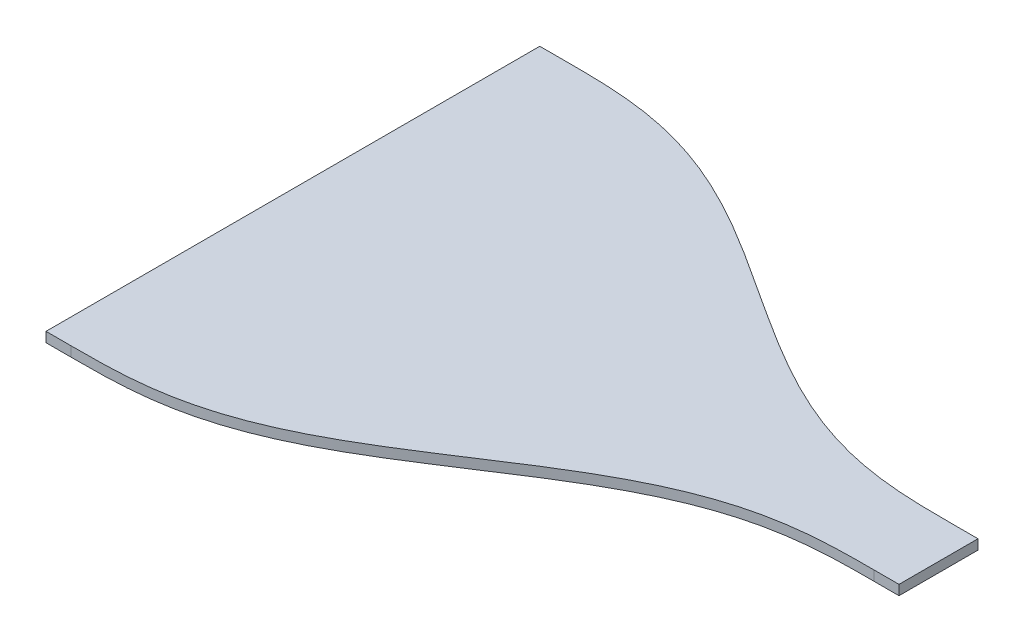
ISO-10303-21;
HEADER;
FILE_DESCRIPTION(('STEP AP214'),'2;1');
FILE_NAME('part.step','',(''),(''),'','','');
FILE_SCHEMA(('AUTOMOTIVE_DESIGN { 1 0 10303 214 1 1 1 1 }'));
ENDSEC;
DATA;
#1=APPLICATION_CONTEXT('core data for automotive mechanical design processes');
#2=APPLICATION_PROTOCOL_DEFINITION('international standard','automotive_design',2000,#1);
#3=PRODUCT_CONTEXT('',#1,'mechanical');
#4=PRODUCT('Part','Part','',(#3));
#5=PRODUCT_RELATED_PRODUCT_CATEGORY('part','',(#4));
#6=PRODUCT_DEFINITION_FORMATION('','',#4);
#7=PRODUCT_DEFINITION_CONTEXT('part definition',#1,'design');
#8=PRODUCT_DEFINITION('design','',#6,#7);
#9=PRODUCT_DEFINITION_SHAPE('','',#8);
#10=(LENGTH_UNIT() NAMED_UNIT(*) SI_UNIT(.MILLI.,.METRE.));
#11=(NAMED_UNIT(*) PLANE_ANGLE_UNIT() SI_UNIT($,.RADIAN.));
#12=(NAMED_UNIT(*) SI_UNIT($,.STERADIAN.) SOLID_ANGLE_UNIT());
#13=UNCERTAINTY_MEASURE_WITH_UNIT(LENGTH_MEASURE(1.E-05),#10,'distance_accuracy_value','');
#14=(GEOMETRIC_REPRESENTATION_CONTEXT(3) GLOBAL_UNCERTAINTY_ASSIGNED_CONTEXT((#13)) GLOBAL_UNIT_ASSIGNED_CONTEXT((#10,
#11,#12)) REPRESENTATION_CONTEXT('',''));
#15=CARTESIAN_POINT('',(0.,0.,0.));
#16=DIRECTION('',(0.,0.,1.));
#17=DIRECTION('',(1.,0.,0.));
#18=AXIS2_PLACEMENT_3D('',#15,#16,#17);
#19=CARTESIAN_POINT('',(628.3600000013,10.,39.9999999998196));
#20=DIRECTION('',(-1.,0.,0.));
#21=DIRECTION('',(0.,0.,1.));
#22=AXIS2_PLACEMENT_3D('',#19,#20,#21);
#23=PLANE('',#22);
#24=DIRECTION('',(0.,0.,-1.));
#25=VECTOR('',#24,1.);
#26=CARTESIAN_POINT('',(628.3600000013,0.,39.9999999998196));
#27=LINE('',#26,#25);
#28=CARTESIAN_POINT('',(628.3600000013,0.,39.9999999998196));
#29=VERTEX_POINT('',#28);
#30=CARTESIAN_POINT('',(628.3600000013,0.,-40.0000000000396));
#31=VERTEX_POINT('',#30);
#32=EDGE_CURVE('E192',#29,#31,#27,.T.);
#33=ORIENTED_EDGE('',*,*,#32,.T.);
#34=DIRECTION('',(0.,-1.,0.));
#35=VECTOR('',#34,1.);
#36=CARTESIAN_POINT('',(628.3600000013,10.,-40.0000000000396));
#37=LINE('',#36,#35);
#38=CARTESIAN_POINT('',(628.3600000013,10.,-40.0000000000396));
#39=VERTEX_POINT('',#38);
#40=EDGE_CURVE('E11',#39,#31,#37,.T.);
#41=ORIENTED_EDGE('',*,*,#40,.F.);
#42=DIRECTION('',(0.,0.,-1.));
#43=VECTOR('',#42,1.);
#44=CARTESIAN_POINT('',(628.3600000013,10.,39.9999999998196));
#45=LINE('',#44,#43);
#46=CARTESIAN_POINT('',(628.3600000013,10.,39.9999999998196));
#47=VERTEX_POINT('',#46);
#48=EDGE_CURVE('E209',#47,#39,#45,.T.);
#49=ORIENTED_EDGE('',*,*,#48,.F.);
#50=DIRECTION('',(0.,-1.,0.));
#51=VECTOR('',#50,1.);
#52=CARTESIAN_POINT('',(628.3600000013,10.,39.9999999998196));
#53=LINE('',#52,#51);
#54=EDGE_CURVE('E125',#47,#29,#53,.T.);
#55=ORIENTED_EDGE('',*,*,#54,.T.);
#56=EDGE_LOOP('',(#33,#41,#49,#55));
#57=FACE_BOUND('',#56,.T.);
#58=ADVANCED_FACE('F33',(#57),#23,.F.);
#59=CARTESIAN_POINT('',(602.9600000013,10.,-40.0000000000396));
#60=DIRECTION('',(0.,0.,1.));
#61=DIRECTION('',(1.,0.,0.));
#62=AXIS2_PLACEMENT_3D('',#59,#60,#61);
#63=PLANE('',#62);
#64=DIRECTION('',(-1.,0.,0.));
#65=VECTOR('',#64,1.);
#66=CARTESIAN_POINT('',(602.9600000013,0.,-40.0000000000396));
#67=LINE('',#66,#65);
#68=CARTESIAN_POINT('',(602.9600000013,0.,-40.0000000000396));
#69=VERTEX_POINT('',#68);
#70=EDGE_CURVE('E189',#31,#69,#67,.T.);
#71=ORIENTED_EDGE('',*,*,#70,.T.);
#72=DIRECTION('',(0.,-1.,0.));
#73=VECTOR('',#72,1.);
#74=CARTESIAN_POINT('',(602.9600000013,10.,-40.0000000000396));
#75=LINE('',#74,#73);
#76=CARTESIAN_POINT('',(602.9600000013,10.,-40.0000000000396));
#77=VERTEX_POINT('',#76);
#78=EDGE_CURVE('E41',#77,#69,#75,.T.);
#79=ORIENTED_EDGE('',*,*,#78,.F.);
#80=DIRECTION('',(-1.,0.,0.));
#81=VECTOR('',#80,1.);
#82=CARTESIAN_POINT('',(602.9600000013,10.,-40.0000000000396));
#83=LINE('',#82,#81);
#84=EDGE_CURVE('E92',#39,#77,#83,.T.);
#85=ORIENTED_EDGE('',*,*,#84,.F.);
#86=ORIENTED_EDGE('',*,*,#40,.T.);
#87=EDGE_LOOP('',(#71,#79,#85,#86));
#88=FACE_BOUND('',#87,.T.);
#89=ADVANCED_FACE('F154',(#88),#63,.F.);
#90=CARTESIAN_POINT('',(602.960000001407,10.,-40.0000000000396));
#91=CARTESIAN_POINT('',(601.828968764817,10.,-40.0000000000395));
#92=CARTESIAN_POINT('',(599.589193262826,10.,-40.0000000379745));
#93=CARTESIAN_POINT('',(594.283488060381,10.,-40.0022157682513));
#94=CARTESIAN_POINT('',(589.919457440368,10.,-40.0179959842549));
#95=CARTESIAN_POINT('',(583.985524287042,10.,-40.0545353512492));
#96=CARTESIAN_POINT('',(578.932534831711,10.,-40.1193118585573));
#97=CARTESIAN_POINT('',(572.056741451444,10.,-40.2443636450084));
#98=CARTESIAN_POINT('',(565.33546819421,10.,-40.4429663080472));
#99=CARTESIAN_POINT('',(558.313030396266,10.,-40.7359357883213));
#100=CARTESIAN_POINT('',(551.261066711014,10.,-41.1438446092437));
#101=CARTESIAN_POINT('',(545.369191286154,10.,-41.5597311978417));
#102=CARTESIAN_POINT('',(539.514027562091,10.,-42.058648284094));
#103=CARTESIAN_POINT('',(533.648357788181,10.,-42.6454520292795));
#104=CARTESIAN_POINT('',(527.803696286015,10.,-43.3243031686937));
#105=CARTESIAN_POINT('',(521.964646592456,10.,-44.0986714821406));
#106=CARTESIAN_POINT('',(514.687032000338,10.,-45.1894996159232));
#107=CARTESIAN_POINT('',(505.983655161913,10.,-46.6992970586992));
#108=CARTESIAN_POINT('',(495.886441901116,10.,-48.759859439909));
#109=CARTESIAN_POINT('',(484.437746207664,10.,-51.5266417609646));
#110=CARTESIAN_POINT('',(473.095033586567,10.,-54.6982051562456));
#111=CARTESIAN_POINT('',(461.868765881894,10.,-58.2602899688746));
#112=CARTESIAN_POINT('',(450.767282366476,10.,-62.1930621203896));
#113=CARTESIAN_POINT('',(439.795009544581,10.,-66.472707341639));
#114=CARTESIAN_POINT('',(428.915328943011,10.,-71.0890373007329));
#115=CARTESIAN_POINT('',(418.128182226315,10.,-76.0177877552463));
#116=CARTESIAN_POINT('',(404.821831781829,10.,-82.5056007695326));
#117=CARTESIAN_POINT('',(389.109463480146,10.,-90.7616634532026));
#118=CARTESIAN_POINT('',(371.139716909059,10.,-100.940384070878));
#119=CARTESIAN_POINT('',(350.986954956719,10.,-113.131465206049));
#120=CARTESIAN_POINT('',(331.083531616839,10.,-125.723038473049));
#121=CARTESIAN_POINT('',(311.331014556509,10.,-138.548686676819));
#122=CARTESIAN_POINT('',(291.62898545345,10.,-151.451312882141));
#123=CARTESIAN_POINT('',(271.876468287283,10.,-164.276962988263));
#124=CARTESIAN_POINT('',(254.460973863669,10.,-175.294585429149));
#125=CARTESIAN_POINT('',(239.377568262097,10.,-184.487962432442));
#126=CARTESIAN_POINT('',(226.674958166475,10.,-191.92562853495));
#127=CARTESIAN_POINT('',(216.421911740623,10.,-197.7178897275));
#128=CARTESIAN_POINT('',(206.031078869437,10.,-203.347077443468));
#129=CARTESIAN_POINT('',(195.491796688084,10.,-208.784697650793));
#130=CARTESIAN_POINT('',(184.831827692497,10.,-213.982198346956));
#131=CARTESIAN_POINT('',(174.044662557852,10.,-218.910987654612));
#132=CARTESIAN_POINT('',(160.454632320874,10.,-224.677267983345));
#133=CARTESIAN_POINT('',(146.684800286889,10.,-229.893458886783));
#134=CARTESIAN_POINT('',(132.700805727171,10.,-234.50896108421));
#135=CARTESIAN_POINT('',(118.522065351502,10.,-238.473331116118));
#136=CARTESIAN_POINT('',(107.073902326192,10.,-241.240157870893));
#137=CARTESIAN_POINT('',(95.5332445328044,10.,-243.595057868691));
#138=CARTESIAN_POINT('',(83.9178291269025,10.,-245.53976584604));
#139=CARTESIAN_POINT('',(72.2406089054652,10.,-247.085714429803));
#140=CARTESIAN_POINT('',(61.9887818599413,10.,-248.108986795793));
#141=CARTESIAN_POINT('',(53.1775235231903,10.,-248.771552860042));
#142=CARTESIAN_POINT('',(45.9672711279011,10.,-249.187011570926));
#143=CARTESIAN_POINT('',(40.3350550397922,10.,-249.444262899305));
#144=CARTESIAN_POINT('',(34.8728406977889,10.,-249.638764529403));
#145=CARTESIAN_POINT('',(29.453823447928,10.,-249.780646369478));
#146=CARTESIAN_POINT('',(24.8671350060192,10.,-249.868183183999));
#147=CARTESIAN_POINT('',(20.6777424132859,10.,-249.921173319688));
#148=CARTESIAN_POINT('',(16.9488270513643,10.,-249.959167008785));
#149=CARTESIAN_POINT('',(12.3138240515522,10.,-249.983976490944));
#150=CARTESIAN_POINT('',(8.79629780648235,10.,-249.99778422102));
#151=CARTESIAN_POINT('',(3.35877029233717,10.,-250.000000003008));
#152=CARTESIAN_POINT('',(1.13103123629953,10.,-250.));
#153=CARTESIAN_POINT('',(2.39415996797719E-10,10.,-250.));
#154=B_SPLINE_CURVE_WITH_KNOTS('',4,(#90,#91,#92,#93,#94,#95,#96,#97,#98,#99,#100,#101,#102,
#103,#104,#105,#106,#107,#108,#109,#110,#111,#112,#113,#114,#115,#116,#117,#118,#119,#120,#121,
#122,#123,#124,#125,#126,#127,#128,#129,#130,#131,#132,#133,#134,#135,#136,#137,#138,#139,#140,
#141,#142,#143,#144,#145,#146,#147,#148,#149,#150,#151,#152,#153),.UNSPECIFIED.,.F.,.F.,(5,1,1,
1,1,1,1,1,1,1,1,1,1,1,1,1,1,1,1,1,1,1,1,1,1,1,1,1,1,1,1,1,1,1,1,1,1,1,1,1,1,1,1,1,1,1,1,1,1,1,1,
1,1,1,1,1,1,1,1,1,5),(0.0781741986426941,0.0851163588564478,0.0920585190702014,
0.0990006792839551,0.105942839497709,0.112884999711463,0.119827159925216,0.133711480352724,
0.141333544060687,0.14895560776865,0.156577671476614,0.164199735184577,0.171821790333472,
0.179443845482367,0.187065900631262,0.194687955780156,0.209932080107854,0.225176204435552,
0.240420329394165,0.255664454352778,0.270908549710445,0.286152645068112,0.30139682696197,
0.316641008855828,0.332099848073137,0.347558687290446,0.378046953694835,0.408535220099223,
0.43902347535238,0.469511730605537,0.500000000000003,0.53048826939447,0.560976524647627,
0.591464779900784,0.606708913102978,0.621953046305172,0.637197179507367,0.652441312709561,
0.667900151926867,0.683358991144173,0.698603173038031,0.713847354931889,0.744335545647224,
0.759579670605836,0.774823795564449,0.790067919892147,0.805312044219845,0.820556154517636,
0.835800264815427,0.851044392231356,0.85866645593932,0.866288519647284,0.873230679861037,
0.880172840074789,0.887115000288541,0.894057160502294,0.89752824060917,0.900999320716046,
0.907941480929798,0.914883641143551,0.921825801357303),.UNSPECIFIED.);
#155=DIRECTION('',(0.,-1.,0.));
#156=VECTOR('',#155,1.);
#157=SURFACE_OF_LINEAR_EXTRUSION('',#154,#156);
#158=CARTESIAN_POINT('',(602.960000001407,0.,-40.0000000000396));
#159=CARTESIAN_POINT('',(601.828968764817,0.,-40.0000000000395));
#160=CARTESIAN_POINT('',(599.589193262826,0.,-40.0000000379745));
#161=CARTESIAN_POINT('',(594.283488060381,0.,-40.0022157682513));
#162=CARTESIAN_POINT('',(589.919457440368,0.,-40.0179959842549));
#163=CARTESIAN_POINT('',(583.985524287042,0.,-40.0545353512492));
#164=CARTESIAN_POINT('',(578.932534831711,0.,-40.1193118585573));
#165=CARTESIAN_POINT('',(572.056741451444,0.,-40.2443636450084));
#166=CARTESIAN_POINT('',(565.33546819421,0.,-40.4429663080472));
#167=CARTESIAN_POINT('',(558.313030396266,0.,-40.7359357883213));
#168=CARTESIAN_POINT('',(551.261066711014,0.,-41.1438446092437));
#169=CARTESIAN_POINT('',(545.369191286154,0.,-41.5597311978417));
#170=CARTESIAN_POINT('',(539.514027562091,0.,-42.058648284094));
#171=CARTESIAN_POINT('',(533.648357788181,0.,-42.6454520292795));
#172=CARTESIAN_POINT('',(527.803696286015,0.,-43.3243031686937));
#173=CARTESIAN_POINT('',(521.964646592456,0.,-44.0986714821406));
#174=CARTESIAN_POINT('',(514.687032000338,0.,-45.1894996159232));
#175=CARTESIAN_POINT('',(505.983655161913,0.,-46.6992970586992));
#176=CARTESIAN_POINT('',(495.886441901116,0.,-48.759859439909));
#177=CARTESIAN_POINT('',(484.437746207664,0.,-51.5266417609646));
#178=CARTESIAN_POINT('',(473.095033586567,0.,-54.6982051562456));
#179=CARTESIAN_POINT('',(461.868765881894,0.,-58.2602899688746));
#180=CARTESIAN_POINT('',(450.767282366476,0.,-62.1930621203896));
#181=CARTESIAN_POINT('',(439.795009544581,0.,-66.472707341639));
#182=CARTESIAN_POINT('',(428.915328943011,0.,-71.0890373007329));
#183=CARTESIAN_POINT('',(418.128182226315,0.,-76.0177877552463));
#184=CARTESIAN_POINT('',(404.821831781829,0.,-82.5056007695326));
#185=CARTESIAN_POINT('',(389.109463480146,0.,-90.7616634532026));
#186=CARTESIAN_POINT('',(371.139716909059,0.,-100.940384070878));
#187=CARTESIAN_POINT('',(350.986954956719,0.,-113.131465206049));
#188=CARTESIAN_POINT('',(331.083531616839,0.,-125.723038473049));
#189=CARTESIAN_POINT('',(311.331014556509,0.,-138.548686676819));
#190=CARTESIAN_POINT('',(291.62898545345,0.,-151.451312882141));
#191=CARTESIAN_POINT('',(271.876468287283,0.,-164.276962988263));
#192=CARTESIAN_POINT('',(254.460973863669,0.,-175.294585429149));
#193=CARTESIAN_POINT('',(239.377568262097,0.,-184.487962432442));
#194=CARTESIAN_POINT('',(226.674958166475,0.,-191.92562853495));
#195=CARTESIAN_POINT('',(216.421911740623,0.,-197.7178897275));
#196=CARTESIAN_POINT('',(206.031078869437,0.,-203.347077443468));
#197=CARTESIAN_POINT('',(195.491796688084,0.,-208.784697650793));
#198=CARTESIAN_POINT('',(184.831827692497,0.,-213.982198346956));
#199=CARTESIAN_POINT('',(174.044662557852,0.,-218.910987654612));
#200=CARTESIAN_POINT('',(160.454632320874,0.,-224.677267983345));
#201=CARTESIAN_POINT('',(146.684800286889,0.,-229.893458886783));
#202=CARTESIAN_POINT('',(132.700805727171,0.,-234.50896108421));
#203=CARTESIAN_POINT('',(118.522065351502,0.,-238.473331116118));
#204=CARTESIAN_POINT('',(107.073902326192,0.,-241.240157870893));
#205=CARTESIAN_POINT('',(95.5332445328044,0.,-243.595057868691));
#206=CARTESIAN_POINT('',(83.9178291269025,0.,-245.53976584604));
#207=CARTESIAN_POINT('',(72.2406089054652,0.,-247.085714429803));
#208=CARTESIAN_POINT('',(61.9887818599413,0.,-248.108986795793));
#209=CARTESIAN_POINT('',(53.1775235231903,0.,-248.771552860042));
#210=CARTESIAN_POINT('',(45.9672711279011,0.,-249.187011570926));
#211=CARTESIAN_POINT('',(40.3350550397922,0.,-249.444262899305));
#212=CARTESIAN_POINT('',(34.8728406977889,0.,-249.638764529403));
#213=CARTESIAN_POINT('',(29.453823447928,0.,-249.780646369478));
#214=CARTESIAN_POINT('',(24.8671350060192,0.,-249.868183183999));
#215=CARTESIAN_POINT('',(20.6777424132859,0.,-249.921173319688));
#216=CARTESIAN_POINT('',(16.9488270513643,0.,-249.959167008785));
#217=CARTESIAN_POINT('',(12.3138240515522,0.,-249.983976490944));
#218=CARTESIAN_POINT('',(8.79629780648235,0.,-249.99778422102));
#219=CARTESIAN_POINT('',(3.35877029233717,0.,-250.000000003008));
#220=CARTESIAN_POINT('',(1.13103123629953,0.,-250.));
#221=CARTESIAN_POINT('',(2.39415996797719E-10,0.,-250.));
#222=B_SPLINE_CURVE_WITH_KNOTS('',4,(#158,#159,#160,#161,#162,#163,#164,#165,#166,#167,#168,
#169,#170,#171,#172,#173,#174,#175,#176,#177,#178,#179,#180,#181,#182,#183,#184,#185,#186,#187,
#188,#189,#190,#191,#192,#193,#194,#195,#196,#197,#198,#199,#200,#201,#202,#203,#204,#205,#206,
#207,#208,#209,#210,#211,#212,#213,#214,#215,#216,#217,#218,#219,#220,#221),.UNSPECIFIED.,.F.,
.F.,(5,1,1,1,1,1,1,1,1,1,1,1,1,1,1,1,1,1,1,1,1,1,1,1,1,1,1,1,1,1,1,1,1,1,1,1,1,1,1,1,1,1,1,1,1,
1,1,1,1,1,1,1,1,1,1,1,1,1,1,1,5),(0.0781741986426941,0.0851163588564478,0.0920585190702014,
0.0990006792839551,0.105942839497709,0.112884999711463,0.119827159925216,0.133711480352724,
0.141333544060687,0.14895560776865,0.156577671476614,0.164199735184577,0.171821790333472,
0.179443845482367,0.187065900631262,0.194687955780156,0.209932080107854,0.225176204435552,
0.240420329394165,0.255664454352778,0.270908549710445,0.286152645068112,0.30139682696197,
0.316641008855828,0.332099848073137,0.347558687290446,0.378046953694835,0.408535220099223,
0.43902347535238,0.469511730605537,0.500000000000003,0.53048826939447,0.560976524647627,
0.591464779900784,0.606708913102978,0.621953046305172,0.637197179507367,0.652441312709561,
0.667900151926867,0.683358991144173,0.698603173038031,0.713847354931889,0.744335545647224,
0.759579670605836,0.774823795564449,0.790067919892147,0.805312044219845,0.820556154517636,
0.835800264815427,0.851044392231356,0.85866645593932,0.866288519647284,0.873230679861037,
0.880172840074789,0.887115000288541,0.894057160502294,0.89752824060917,0.900999320716046,
0.907941480929798,0.914883641143551,0.921825801357303),.UNSPECIFIED.);
#223=CARTESIAN_POINT('',(2.39415996797719E-10,0.,-250.));
#224=VERTEX_POINT('',#223);
#225=EDGE_CURVE('E185',#69,#224,#222,.T.);
#226=ORIENTED_EDGE('',*,*,#225,.T.);
#227=DIRECTION('',(0.,-1.,0.));
#228=VECTOR('',#227,1.);
#229=CARTESIAN_POINT('',(2.39415996797719E-10,10.,-250.));
#230=LINE('',#229,#228);
#231=CARTESIAN_POINT('',(2.39415996797719E-10,10.,-250.));
#232=VERTEX_POINT('',#231);
#233=EDGE_CURVE('E177',#232,#224,#230,.T.);
#234=ORIENTED_EDGE('',*,*,#233,.F.);
#235=EDGE_CURVE('E156',#77,#232,#154,.T.);
#236=ORIENTED_EDGE('',*,*,#235,.F.);
#237=ORIENTED_EDGE('',*,*,#78,.T.);
#238=EDGE_LOOP('',(#226,#234,#236,#237));
#239=FACE_BOUND('',#238,.T.);
#240=ADVANCED_FACE('F150',(#239),#157,.F.);
#241=CARTESIAN_POINT('',(2.09489326927215E-10,10.,-250.));
#242=DIRECTION('',(0.,0.,1.));
#243=DIRECTION('',(1.,0.,0.));
#244=AXIS2_PLACEMENT_3D('',#241,#242,#243);
#245=PLANE('',#244);
#246=DIRECTION('',(-1.,0.,0.));
#247=VECTOR('',#246,1.);
#248=CARTESIAN_POINT('',(2.09489326927215E-10,0.,-250.));
#249=LINE('',#248,#247);
#250=CARTESIAN_POINT('',(-25.3999999997905,0.,-250.));
#251=VERTEX_POINT('',#250);
#252=EDGE_CURVE('E175',#224,#251,#249,.T.);
#253=ORIENTED_EDGE('',*,*,#252,.T.);
#254=DIRECTION('',(0.,-1.,0.));
#255=VECTOR('',#254,1.);
#256=CARTESIAN_POINT('',(-25.3999999997905,10.,-250.));
#257=LINE('',#256,#255);
#258=CARTESIAN_POINT('',(-25.3999999997905,10.,-250.));
#259=VERTEX_POINT('',#258);
#260=EDGE_CURVE('E173',#259,#251,#257,.T.);
#261=ORIENTED_EDGE('',*,*,#260,.F.);
#262=DIRECTION('',(-1.,0.,0.));
#263=VECTOR('',#262,1.);
#264=CARTESIAN_POINT('',(2.09489326927215E-10,10.,-250.));
#265=LINE('',#264,#263);
#266=EDGE_CURVE('E162',#232,#259,#265,.T.);
#267=ORIENTED_EDGE('',*,*,#266,.F.);
#268=ORIENTED_EDGE('',*,*,#233,.T.);
#269=EDGE_LOOP('',(#253,#261,#267,#268));
#270=FACE_BOUND('',#269,.T.);
#271=ADVANCED_FACE('F146',(#270),#245,.F.);
#272=CARTESIAN_POINT('',(-25.3999999997905,10.,250.));
#273=DIRECTION('',(1.,0.,0.));
#274=DIRECTION('',(0.,0.,-1.));
#275=AXIS2_PLACEMENT_3D('',#272,#273,#274);
#276=PLANE('',#275);
#277=DIRECTION('',(0.,0.,1.));
#278=VECTOR('',#277,1.);
#279=CARTESIAN_POINT('',(-25.3999999997905,0.,250.));
#280=LINE('',#279,#278);
#281=CARTESIAN_POINT('',(-25.3999999997905,0.,250.));
#282=VERTEX_POINT('',#281);
#283=EDGE_CURVE('E179',#251,#282,#280,.T.);
#284=ORIENTED_EDGE('',*,*,#283,.T.);
#285=DIRECTION('',(0.,-1.,0.));
#286=VECTOR('',#285,1.);
#287=CARTESIAN_POINT('',(-25.3999999997905,10.,250.));
#288=LINE('',#287,#286);
#289=CARTESIAN_POINT('',(-25.3999999997905,10.,250.));
#290=VERTEX_POINT('',#289);
#291=EDGE_CURVE('E120',#290,#282,#288,.T.);
#292=ORIENTED_EDGE('',*,*,#291,.F.);
#293=DIRECTION('',(0.,0.,1.));
#294=VECTOR('',#293,1.);
#295=CARTESIAN_POINT('',(-25.3999999997905,10.,250.));
#296=LINE('',#295,#294);
#297=EDGE_CURVE('E111',#259,#290,#296,.T.);
#298=ORIENTED_EDGE('',*,*,#297,.F.);
#299=ORIENTED_EDGE('',*,*,#260,.T.);
#300=EDGE_LOOP('',(#284,#292,#298,#299));
#301=FACE_BOUND('',#300,.T.);
#302=ADVANCED_FACE('F143',(#301),#276,.F.);
#303=CARTESIAN_POINT('',(2.09486453791458E-10,10.,250.));
#304=DIRECTION('',(0.,0.,-1.));
#305=DIRECTION('',(-1.,0.,0.));
#306=AXIS2_PLACEMENT_3D('',#303,#304,#305);
#307=PLANE('',#306);
#308=DIRECTION('',(1.,0.,0.));
#309=VECTOR('',#308,1.);
#310=CARTESIAN_POINT('',(2.09486453791458E-10,0.,250.));
#311=LINE('',#310,#309);
#312=CARTESIAN_POINT('',(2.09486453791458E-10,0.,250.));
#313=VERTEX_POINT('',#312);
#314=EDGE_CURVE('E119',#282,#313,#311,.T.);
#315=ORIENTED_EDGE('',*,*,#314,.T.);
#316=DIRECTION('',(0.,-1.,0.));
#317=VECTOR('',#316,1.);
#318=CARTESIAN_POINT('',(2.09486453791458E-10,10.,250.));
#319=LINE('',#318,#317);
#320=CARTESIAN_POINT('',(2.09486453791458E-10,10.,250.));
#321=VERTEX_POINT('',#320);
#322=EDGE_CURVE('E116',#321,#313,#319,.T.);
#323=ORIENTED_EDGE('',*,*,#322,.F.);
#324=DIRECTION('',(1.,0.,0.));
#325=VECTOR('',#324,1.);
#326=CARTESIAN_POINT('',(2.09486453791458E-10,10.,250.));
#327=LINE('',#326,#325);
#328=EDGE_CURVE('E105',#290,#321,#327,.T.);
#329=ORIENTED_EDGE('',*,*,#328,.F.);
#330=ORIENTED_EDGE('',*,*,#291,.T.);
#331=EDGE_LOOP('',(#315,#323,#329,#330));
#332=FACE_BOUND('',#331,.T.);
#333=ADVANCED_FACE('F117',(#332),#307,.F.);
#334=CARTESIAN_POINT('',(2.39412823101957E-10,10.,250.));
#335=CARTESIAN_POINT('',(1.13103123629173,10.,250.));
#336=CARTESIAN_POINT('',(3.35877029233124,10.,250.000000003006));
#337=CARTESIAN_POINT('',(8.79629780645916,10.,249.997784221017));
#338=CARTESIAN_POINT('',(12.3138240515223,10.,249.983976490939));
#339=CARTESIAN_POINT('',(16.9488270513344,10.,249.959167008779));
#340=CARTESIAN_POINT('',(20.677742413256,10.,249.921173319681));
#341=CARTESIAN_POINT('',(24.8671350059893,10.,249.86818318399));
#342=CARTESIAN_POINT('',(29.4538234478981,10.,249.780646369467));
#343=CARTESIAN_POINT('',(34.872840697759,10.,249.63876452939));
#344=CARTESIAN_POINT('',(40.3350550397622,10.,249.44426289929));
#345=CARTESIAN_POINT('',(45.967271127871,10.,249.187011570909));
#346=CARTESIAN_POINT('',(53.1775235231601,10.,248.771552860022));
#347=CARTESIAN_POINT('',(61.9887818599108,10.,248.10898679577));
#348=CARTESIAN_POINT('',(72.2406089054343,10.,247.085714429777));
#349=CARTESIAN_POINT('',(83.9178291268711,10.,245.53976584601));
#350=CARTESIAN_POINT('',(95.5332445327723,10.,243.595057868656));
#351=CARTESIAN_POINT('',(107.07390232616,10.,241.240157870854));
#352=CARTESIAN_POINT('',(118.522065351468,10.,238.473331116075));
#353=CARTESIAN_POINT('',(132.700805727136,10.,234.508961084161));
#354=CARTESIAN_POINT('',(146.684800286852,10.,229.89345888673));
#355=CARTESIAN_POINT('',(160.454632320835,10.,224.677267983287));
#356=CARTESIAN_POINT('',(174.044662557811,10.,218.910987654548));
#357=CARTESIAN_POINT('',(184.831827692454,10.,213.982198346889));
#358=CARTESIAN_POINT('',(195.491796688039,10.,208.784697650722));
#359=CARTESIAN_POINT('',(206.03107886939,10.,203.347077443392));
#360=CARTESIAN_POINT('',(216.421911740574,10.,197.717889727421));
#361=CARTESIAN_POINT('',(226.674958166424,10.,191.925628534867));
#362=CARTESIAN_POINT('',(239.377568262043,10.,184.487962432355));
#363=CARTESIAN_POINT('',(254.460973863612,10.,175.294585429056));
#364=CARTESIAN_POINT('',(271.876468287222,10.,164.276962988164));
#365=CARTESIAN_POINT('',(291.628985453384,10.,151.451312882034));
#366=CARTESIAN_POINT('',(311.331014556438,10.,138.548686676706));
#367=CARTESIAN_POINT('',(331.083531616764,10.,125.723038472929));
#368=CARTESIAN_POINT('',(350.986954956639,10.,113.131465205921));
#369=CARTESIAN_POINT('',(371.139716908975,10.,100.940384070742));
#370=CARTESIAN_POINT('',(389.109463480058,10.,90.7616634530606));
#371=CARTESIAN_POINT('',(404.821831781738,10.,82.5056007693849));
#372=CARTESIAN_POINT('',(418.128182226222,10.,76.0177877550937));
#373=CARTESIAN_POINT('',(428.915328942916,10.,71.0890373005764));
#374=CARTESIAN_POINT('',(439.795009544484,10.,66.4727073414786));
#375=CARTESIAN_POINT('',(450.767282366377,10.,62.1930621202251));
#376=CARTESIAN_POINT('',(461.868765881794,10.,58.2602899687061));
#377=CARTESIAN_POINT('',(473.095033586466,10.,54.698205156073));
#378=CARTESIAN_POINT('',(484.437746207562,10.,51.5266417607878));
#379=CARTESIAN_POINT('',(495.886441901013,10.,48.7598594397281));
#380=CARTESIAN_POINT('',(505.983655161808,10.,46.6992970585145));
#381=CARTESIAN_POINT('',(514.687032000233,10.,45.1894996157354));
#382=CARTESIAN_POINT('',(521.964646592351,10.,44.0986714819502));
#383=CARTESIAN_POINT('',(527.80369628591,10.,43.3243031685011));
#384=CARTESIAN_POINT('',(533.648357788075,10.,42.6454520290848));
#385=CARTESIAN_POINT('',(539.514027561985,10.,42.0586482838972));
#386=CARTESIAN_POINT('',(545.369191286049,10.,41.5597311976427));
#387=CARTESIAN_POINT('',(551.261066710907,10.,41.1438446090425));
#388=CARTESIAN_POINT('',(558.31303039616,10.,40.7359357881176));
#389=CARTESIAN_POINT('',(565.335468194103,10.,40.4429663078409));
#390=CARTESIAN_POINT('',(572.056741451337,10.,40.2443636447996));
#391=CARTESIAN_POINT('',(578.932534831605,10.,40.1193118583461));
#392=CARTESIAN_POINT('',(583.985524286936,10.,40.0545353510361));
#393=CARTESIAN_POINT('',(589.919457440262,10.,40.0179959840397));
#394=CARTESIAN_POINT('',(594.2834880603,10.,40.0022157680343));
#395=CARTESIAN_POINT('',(599.589193262804,10.,40.0000000377557));
#396=CARTESIAN_POINT('',(601.828968764789,10.,39.9999999998199));
#397=CARTESIAN_POINT('',(602.960000001407,10.,39.9999999998195));
#398=B_SPLINE_CURVE_WITH_KNOTS('',4,(#334,#335,#336,#337,#338,#339,#340,#341,#342,#343,#344,
#345,#346,#347,#348,#349,#350,#351,#352,#353,#354,#355,#356,#357,#358,#359,#360,#361,#362,#363,
#364,#365,#366,#367,#368,#369,#370,#371,#372,#373,#374,#375,#376,#377,#378,#379,#380,#381,#382,
#383,#384,#385,#386,#387,#388,#389,#390,#391,#392,#393,#394,#395,#396,#397),.UNSPECIFIED.,.F.,
.F.,(5,1,1,1,1,1,1,1,1,1,1,1,1,1,1,1,1,1,1,1,1,1,1,1,1,1,1,1,1,1,1,1,1,1,1,1,1,1,1,1,1,1,1,1,1,
1,1,1,1,1,1,1,1,1,1,1,1,1,1,1,5),(0.0781741986426941,0.0851163588564464,0.0920585190701987,
0.099000679283951,0.102471759390827,0.105942839497703,0.112884999711456,0.119827159925208,
0.12676932013896,0.133711480352713,0.141333544060677,0.148955607768641,0.16419973518457,
0.179443845482361,0.194687955780152,0.20993208010785,0.225176204435548,0.240420329394161,
0.255664454352773,0.286152645068108,0.301396826961966,0.316641008855824,0.33209984807313,
0.347558687290436,0.36280282049263,0.378046953694825,0.393291086897019,0.408535220099213,
0.43902347535237,0.469511730605527,0.499999999999994,0.53048826939446,0.560976524647617,
0.591464779900774,0.621953046305162,0.652441312709551,0.66790015192686,0.683358991144169,
0.698603173038027,0.713847354931885,0.729091450289552,0.744335545647219,0.759579670605832,
0.774823795564445,0.790067919892143,0.805312044219841,0.812934099368736,0.82055615451763,
0.828178209666525,0.83580026481542,0.843422328523383,0.851044392231347,0.85866645593931,
0.866288519647273,0.880172840074781,0.887115000288535,0.894057160502288,0.900999320716042,
0.907941480929796,0.914883641143549,0.921825801357303),.UNSPECIFIED.);
#399=DIRECTION('',(0.,-1.,0.));
#400=VECTOR('',#399,1.);
#401=SURFACE_OF_LINEAR_EXTRUSION('',#398,#400);
#402=CARTESIAN_POINT('',(2.39412823101957E-10,0.,250.));
#403=CARTESIAN_POINT('',(1.13103123629173,0.,250.));
#404=CARTESIAN_POINT('',(3.35877029233124,0.,250.000000003006));
#405=CARTESIAN_POINT('',(8.79629780645916,0.,249.997784221017));
#406=CARTESIAN_POINT('',(12.3138240515223,0.,249.983976490939));
#407=CARTESIAN_POINT('',(16.9488270513344,0.,249.959167008779));
#408=CARTESIAN_POINT('',(20.677742413256,0.,249.921173319681));
#409=CARTESIAN_POINT('',(24.8671350059893,0.,249.86818318399));
#410=CARTESIAN_POINT('',(29.4538234478981,0.,249.780646369467));
#411=CARTESIAN_POINT('',(34.872840697759,0.,249.63876452939));
#412=CARTESIAN_POINT('',(40.3350550397622,0.,249.44426289929));
#413=CARTESIAN_POINT('',(45.967271127871,0.,249.187011570909));
#414=CARTESIAN_POINT('',(53.1775235231601,0.,248.771552860022));
#415=CARTESIAN_POINT('',(61.9887818599108,0.,248.10898679577));
#416=CARTESIAN_POINT('',(72.2406089054343,0.,247.085714429777));
#417=CARTESIAN_POINT('',(83.9178291268711,0.,245.53976584601));
#418=CARTESIAN_POINT('',(95.5332445327723,0.,243.595057868656));
#419=CARTESIAN_POINT('',(107.07390232616,0.,241.240157870854));
#420=CARTESIAN_POINT('',(118.522065351468,0.,238.473331116075));
#421=CARTESIAN_POINT('',(132.700805727136,0.,234.508961084161));
#422=CARTESIAN_POINT('',(146.684800286852,0.,229.89345888673));
#423=CARTESIAN_POINT('',(160.454632320835,0.,224.677267983287));
#424=CARTESIAN_POINT('',(174.044662557811,0.,218.910987654548));
#425=CARTESIAN_POINT('',(184.831827692454,0.,213.982198346889));
#426=CARTESIAN_POINT('',(195.491796688039,0.,208.784697650722));
#427=CARTESIAN_POINT('',(206.03107886939,0.,203.347077443392));
#428=CARTESIAN_POINT('',(216.421911740574,0.,197.717889727421));
#429=CARTESIAN_POINT('',(226.674958166424,0.,191.925628534867));
#430=CARTESIAN_POINT('',(239.377568262043,0.,184.487962432355));
#431=CARTESIAN_POINT('',(254.460973863612,0.,175.294585429056));
#432=CARTESIAN_POINT('',(271.876468287222,0.,164.276962988164));
#433=CARTESIAN_POINT('',(291.628985453384,0.,151.451312882034));
#434=CARTESIAN_POINT('',(311.331014556438,0.,138.548686676706));
#435=CARTESIAN_POINT('',(331.083531616764,0.,125.723038472929));
#436=CARTESIAN_POINT('',(350.986954956639,0.,113.131465205921));
#437=CARTESIAN_POINT('',(371.139716908975,0.,100.940384070742));
#438=CARTESIAN_POINT('',(389.109463480058,0.,90.7616634530606));
#439=CARTESIAN_POINT('',(404.821831781738,0.,82.5056007693849));
#440=CARTESIAN_POINT('',(418.128182226222,0.,76.0177877550937));
#441=CARTESIAN_POINT('',(428.915328942916,0.,71.0890373005764));
#442=CARTESIAN_POINT('',(439.795009544484,0.,66.4727073414786));
#443=CARTESIAN_POINT('',(450.767282366377,0.,62.1930621202251));
#444=CARTESIAN_POINT('',(461.868765881794,0.,58.2602899687061));
#445=CARTESIAN_POINT('',(473.095033586466,0.,54.698205156073));
#446=CARTESIAN_POINT('',(484.437746207562,0.,51.5266417607878));
#447=CARTESIAN_POINT('',(495.886441901013,0.,48.7598594397281));
#448=CARTESIAN_POINT('',(505.983655161808,0.,46.6992970585145));
#449=CARTESIAN_POINT('',(514.687032000233,0.,45.1894996157354));
#450=CARTESIAN_POINT('',(521.964646592351,0.,44.0986714819502));
#451=CARTESIAN_POINT('',(527.80369628591,0.,43.3243031685011));
#452=CARTESIAN_POINT('',(533.648357788075,0.,42.6454520290848));
#453=CARTESIAN_POINT('',(539.514027561985,0.,42.0586482838972));
#454=CARTESIAN_POINT('',(545.369191286049,0.,41.5597311976427));
#455=CARTESIAN_POINT('',(551.261066710907,0.,41.1438446090425));
#456=CARTESIAN_POINT('',(558.31303039616,0.,40.7359357881176));
#457=CARTESIAN_POINT('',(565.335468194103,0.,40.4429663078409));
#458=CARTESIAN_POINT('',(572.056741451337,0.,40.2443636447996));
#459=CARTESIAN_POINT('',(578.932534831605,0.,40.1193118583461));
#460=CARTESIAN_POINT('',(583.985524286936,0.,40.0545353510361));
#461=CARTESIAN_POINT('',(589.919457440262,0.,40.0179959840397));
#462=CARTESIAN_POINT('',(594.2834880603,0.,40.0022157680343));
#463=CARTESIAN_POINT('',(599.589193262804,0.,40.0000000377557));
#464=CARTESIAN_POINT('',(601.828968764789,0.,39.9999999998199));
#465=CARTESIAN_POINT('',(602.960000001407,0.,39.9999999998195));
#466=B_SPLINE_CURVE_WITH_KNOTS('',4,(#402,#403,#404,#405,#406,#407,#408,#409,#410,#411,#412,
#413,#414,#415,#416,#417,#418,#419,#420,#421,#422,#423,#424,#425,#426,#427,#428,#429,#430,#431,
#432,#433,#434,#435,#436,#437,#438,#439,#440,#441,#442,#443,#444,#445,#446,#447,#448,#449,#450,
#451,#452,#453,#454,#455,#456,#457,#458,#459,#460,#461,#462,#463,#464,#465),.UNSPECIFIED.,.F.,
.F.,(5,1,1,1,1,1,1,1,1,1,1,1,1,1,1,1,1,1,1,1,1,1,1,1,1,1,1,1,1,1,1,1,1,1,1,1,1,1,1,1,1,1,1,1,1,
1,1,1,1,1,1,1,1,1,1,1,1,1,1,1,5),(0.0781741986426941,0.0851163588564464,0.0920585190701987,
0.099000679283951,0.102471759390827,0.105942839497703,0.112884999711456,0.119827159925208,
0.12676932013896,0.133711480352713,0.141333544060677,0.148955607768641,0.16419973518457,
0.179443845482361,0.194687955780152,0.20993208010785,0.225176204435548,0.240420329394161,
0.255664454352773,0.286152645068108,0.301396826961966,0.316641008855824,0.33209984807313,
0.347558687290436,0.36280282049263,0.378046953694825,0.393291086897019,0.408535220099213,
0.43902347535237,0.469511730605527,0.499999999999994,0.53048826939446,0.560976524647617,
0.591464779900774,0.621953046305162,0.652441312709551,0.66790015192686,0.683358991144169,
0.698603173038027,0.713847354931885,0.729091450289552,0.744335545647219,0.759579670605832,
0.774823795564445,0.790067919892143,0.805312044219841,0.812934099368736,0.82055615451763,
0.828178209666525,0.83580026481542,0.843422328523383,0.851044392231347,0.85866645593931,
0.866288519647273,0.880172840074781,0.887115000288535,0.894057160502288,0.900999320716042,
0.907941480929796,0.914883641143549,0.921825801357303),.UNSPECIFIED.);
#467=CARTESIAN_POINT('',(602.960000001407,0.,39.9999999998195));
#468=VERTEX_POINT('',#467);
#469=EDGE_CURVE('E78',#313,#468,#466,.T.);
#470=ORIENTED_EDGE('',*,*,#469,.T.);
#471=DIRECTION('',(0.,-1.,0.));
#472=VECTOR('',#471,1.);
#473=CARTESIAN_POINT('',(602.960000001407,10.,39.9999999998195));
#474=LINE('',#473,#472);
#475=CARTESIAN_POINT('',(602.960000001407,10.,39.9999999998195));
#476=VERTEX_POINT('',#475);
#477=EDGE_CURVE('E121',#476,#468,#474,.T.);
#478=ORIENTED_EDGE('',*,*,#477,.F.);
#479=EDGE_CURVE('E109',#321,#476,#398,.T.);
#480=ORIENTED_EDGE('',*,*,#479,.F.);
#481=ORIENTED_EDGE('',*,*,#322,.T.);
#482=EDGE_LOOP('',(#470,#478,#480,#481));
#483=FACE_BOUND('',#482,.T.);
#484=ADVANCED_FACE('F123',(#483),#401,.F.);
#485=CARTESIAN_POINT('',(602.9600000013,10.,39.9999999998196));
#486=DIRECTION('',(0.,0.,-1.));
#487=DIRECTION('',(-1.,0.,0.));
#488=AXIS2_PLACEMENT_3D('',#485,#486,#487);
#489=PLANE('',#488);
#490=DIRECTION('',(1.,0.,0.));
#491=VECTOR('',#490,1.);
#492=CARTESIAN_POINT('',(602.9600000013,0.,39.9999999998196));
#493=LINE('',#492,#491);
#494=EDGE_CURVE('E84',#468,#29,#493,.T.);
#495=ORIENTED_EDGE('',*,*,#494,.T.);
#496=ORIENTED_EDGE('',*,*,#54,.F.);
#497=DIRECTION('',(1.,0.,0.));
#498=VECTOR('',#497,1.);
#499=CARTESIAN_POINT('',(602.9600000013,10.,39.9999999998196));
#500=LINE('',#499,#498);
#501=EDGE_CURVE('E49',#476,#47,#500,.T.);
#502=ORIENTED_EDGE('',*,*,#501,.F.);
#503=ORIENTED_EDGE('',*,*,#477,.T.);
#504=EDGE_LOOP('',(#495,#496,#502,#503));
#505=FACE_BOUND('',#504,.T.);
#506=ADVANCED_FACE('F139',(#505),#489,.F.);
#507=CARTESIAN_POINT('',(301.480000000573,10.,-144.999999858743));
#508=DIRECTION('',(0.,1.,0.));
#509=DIRECTION('',(0.,0.,1.));
#510=AXIS2_PLACEMENT_3D('',#507,#508,#509);
#511=PLANE('',#510);
#512=ORIENTED_EDGE('',*,*,#48,.T.);
#513=ORIENTED_EDGE('',*,*,#84,.T.);
#514=ORIENTED_EDGE('',*,*,#235,.T.);
#515=ORIENTED_EDGE('',*,*,#266,.T.);
#516=ORIENTED_EDGE('',*,*,#297,.T.);
#517=ORIENTED_EDGE('',*,*,#328,.T.);
#518=ORIENTED_EDGE('',*,*,#479,.T.);
#519=ORIENTED_EDGE('',*,*,#501,.T.);
#520=EDGE_LOOP('',(#512,#513,#514,#515,#516,#517,#518,#519));
#521=FACE_BOUND('',#520,.T.);
#522=ADVANCED_FACE('F107',(#521),#511,.T.);
#523=CARTESIAN_POINT('',(301.480000000573,0.,-144.999999858743));
#524=DIRECTION('',(0.,1.,0.));
#525=DIRECTION('',(0.,0.,1.));
#526=AXIS2_PLACEMENT_3D('',#523,#524,#525);
#527=PLANE('',#526);
#528=ORIENTED_EDGE('',*,*,#32,.F.);
#529=ORIENTED_EDGE('',*,*,#494,.F.);
#530=ORIENTED_EDGE('',*,*,#469,.F.);
#531=ORIENTED_EDGE('',*,*,#314,.F.);
#532=ORIENTED_EDGE('',*,*,#283,.F.);
#533=ORIENTED_EDGE('',*,*,#252,.F.);
#534=ORIENTED_EDGE('',*,*,#225,.F.);
#535=ORIENTED_EDGE('',*,*,#70,.F.);
#536=EDGE_LOOP('',(#528,#529,#530,#531,#532,#533,#534,#535));
#537=FACE_BOUND('',#536,.T.);
#538=ADVANCED_FACE('F188',(#537),#527,.F.);
#539=CLOSED_SHELL('',(#58,#89,#240,#271,#302,#333,#484,#506,#522,#538));
#540=MANIFOLD_SOLID_BREP('B2',#539);
#541=ADVANCED_BREP_SHAPE_REPRESENTATION('',(#18,#540),#14);
#542=SHAPE_DEFINITION_REPRESENTATION(#9,#541);
ENDSEC;
END-ISO-10303-21;
